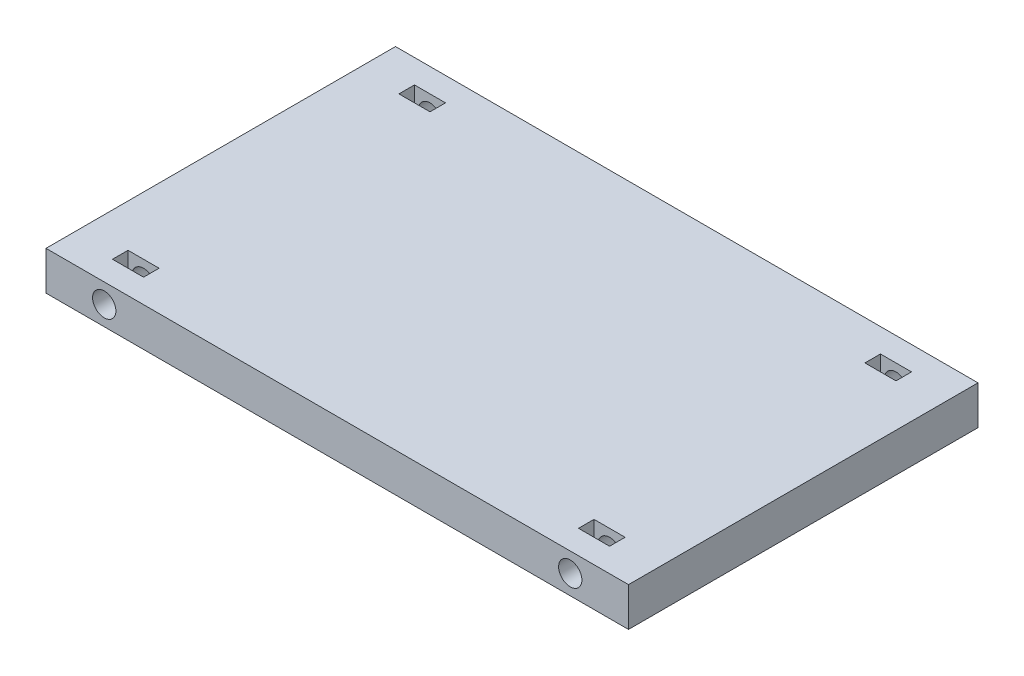
ISO-10303-21;
HEADER;
FILE_DESCRIPTION(('STEP AP214'),'2;1');
FILE_NAME('part.step','',(''),(''),'','','');
FILE_SCHEMA(('AUTOMOTIVE_DESIGN { 1 0 10303 214 1 1 1 1 }'));
ENDSEC;
DATA;
#1=APPLICATION_CONTEXT('core data for automotive mechanical design processes');
#2=APPLICATION_PROTOCOL_DEFINITION('international standard','automotive_design',2000,#1);
#3=PRODUCT_CONTEXT('',#1,'mechanical');
#4=PRODUCT('Part','Part','',(#3));
#5=PRODUCT_RELATED_PRODUCT_CATEGORY('part','',(#4));
#6=PRODUCT_DEFINITION_FORMATION('','',#4);
#7=PRODUCT_DEFINITION_CONTEXT('part definition',#1,'design');
#8=PRODUCT_DEFINITION('design','',#6,#7);
#9=PRODUCT_DEFINITION_SHAPE('','',#8);
#10=(LENGTH_UNIT() NAMED_UNIT(*) SI_UNIT(.MILLI.,.METRE.));
#11=(NAMED_UNIT(*) PLANE_ANGLE_UNIT() SI_UNIT($,.RADIAN.));
#12=(NAMED_UNIT(*) SI_UNIT($,.STERADIAN.) SOLID_ANGLE_UNIT());
#13=UNCERTAINTY_MEASURE_WITH_UNIT(LENGTH_MEASURE(1.E-05),#10,'distance_accuracy_value','');
#14=(GEOMETRIC_REPRESENTATION_CONTEXT(3) GLOBAL_UNCERTAINTY_ASSIGNED_CONTEXT((#13)) GLOBAL_UNIT_ASSIGNED_CONTEXT((#10,
#11,#12)) REPRESENTATION_CONTEXT('',''));
#15=CARTESIAN_POINT('',(0.,0.,0.));
#16=DIRECTION('',(0.,0.,1.));
#17=DIRECTION('',(1.,0.,0.));
#18=AXIS2_PLACEMENT_3D('',#15,#16,#17);
#19=CARTESIAN_POINT('',(0.,10.,0.));
#20=DIRECTION('',(0.,-1.,0.));
#21=DIRECTION('',(0.,0.,-1.));
#22=AXIS2_PLACEMENT_3D('',#19,#20,#21);
#23=PLANE('',#22);
#24=DIRECTION('',(-1.,0.,0.));
#25=VECTOR('',#24,1.);
#26=CARTESIAN_POINT('',(131.,10.,-10.1205593047083));
#27=LINE('',#26,#25);
#28=CARTESIAN_POINT('',(139.,10.,-10.1205593047083));
#29=VERTEX_POINT('',#28);
#30=CARTESIAN_POINT('',(131.,10.,-10.1205593047083));
#31=VERTEX_POINT('',#30);
#32=EDGE_CURVE('E210',#29,#31,#27,.T.);
#33=ORIENTED_EDGE('',*,*,#32,.F.);
#34=DIRECTION('',(0.,0.,-1.));
#35=VECTOR('',#34,1.);
#36=CARTESIAN_POINT('',(139.,10.,-10.1205593047083));
#37=LINE('',#36,#35);
#38=CARTESIAN_POINT('',(139.,10.,-6.12055930470834));
#39=VERTEX_POINT('',#38);
#40=EDGE_CURVE('E218',#39,#29,#37,.T.);
#41=ORIENTED_EDGE('',*,*,#40,.F.);
#42=DIRECTION('',(1.,0.,0.));
#43=VECTOR('',#42,1.);
#44=CARTESIAN_POINT('',(131.,10.,-6.12055930470834));
#45=LINE('',#44,#43);
#46=CARTESIAN_POINT('',(131.,10.,-6.12055930470834));
#47=VERTEX_POINT('',#46);
#48=EDGE_CURVE('E215',#47,#39,#45,.T.);
#49=ORIENTED_EDGE('',*,*,#48,.F.);
#50=DIRECTION('',(0.,0.,1.));
#51=VECTOR('',#50,1.);
#52=CARTESIAN_POINT('',(131.,10.,-10.1205593047083));
#53=LINE('',#52,#51);
#54=EDGE_CURVE('E212',#31,#47,#53,.T.);
#55=ORIENTED_EDGE('',*,*,#54,.F.);
#56=EDGE_LOOP('',(#33,#41,#49,#55));
#57=FACE_BOUND('',#56,.T.);
#58=DIRECTION('',(0.,0.,1.));
#59=VECTOR('',#58,1.);
#60=CARTESIAN_POINT('',(11.,10.,-83.8794406952916));
#61=LINE('',#60,#59);
#62=CARTESIAN_POINT('',(11.,10.,-83.8794406952916));
#63=VERTEX_POINT('',#62);
#64=CARTESIAN_POINT('',(11.,10.,-79.8794406952916));
#65=VERTEX_POINT('',#64);
#66=EDGE_CURVE('E272',#63,#65,#61,.T.);
#67=ORIENTED_EDGE('',*,*,#66,.F.);
#68=DIRECTION('',(-1.,0.,0.));
#69=VECTOR('',#68,1.);
#70=CARTESIAN_POINT('',(11.,10.,-83.8794406952916));
#71=LINE('',#70,#69);
#72=CARTESIAN_POINT('',(19.,10.,-83.8794406952916));
#73=VERTEX_POINT('',#72);
#74=EDGE_CURVE('E280',#73,#63,#71,.T.);
#75=ORIENTED_EDGE('',*,*,#74,.F.);
#76=DIRECTION('',(0.,0.,-1.));
#77=VECTOR('',#76,1.);
#78=CARTESIAN_POINT('',(19.,10.,-83.8794406952916));
#79=LINE('',#78,#77);
#80=CARTESIAN_POINT('',(19.,10.,-79.8794406952916));
#81=VERTEX_POINT('',#80);
#82=EDGE_CURVE('E277',#81,#73,#79,.T.);
#83=ORIENTED_EDGE('',*,*,#82,.F.);
#84=DIRECTION('',(1.,0.,0.));
#85=VECTOR('',#84,1.);
#86=CARTESIAN_POINT('',(11.,10.,-79.8794406952916));
#87=LINE('',#86,#85);
#88=EDGE_CURVE('E274',#65,#81,#87,.T.);
#89=ORIENTED_EDGE('',*,*,#88,.F.);
#90=EDGE_LOOP('',(#67,#75,#83,#89));
#91=FACE_BOUND('',#90,.T.);
#92=DIRECTION('',(0.,0.,1.));
#93=VECTOR('',#92,1.);
#94=CARTESIAN_POINT('',(0.,10.,0.));
#95=LINE('',#94,#93);
#96=CARTESIAN_POINT('',(0.,10.,-90.));
#97=VERTEX_POINT('',#96);
#98=CARTESIAN_POINT('',(0.,10.,0.));
#99=VERTEX_POINT('',#98);
#100=EDGE_CURVE('E303',#97,#99,#95,.T.);
#101=ORIENTED_EDGE('',*,*,#100,.T.);
#102=DIRECTION('',(1.,0.,0.));
#103=VECTOR('',#102,1.);
#104=CARTESIAN_POINT('',(0.,10.,0.));
#105=LINE('',#104,#103);
#106=CARTESIAN_POINT('',(150.,10.,0.));
#107=VERTEX_POINT('',#106);
#108=EDGE_CURVE('E306',#99,#107,#105,.T.);
#109=ORIENTED_EDGE('',*,*,#108,.T.);
#110=DIRECTION('',(0.,0.,-1.));
#111=VECTOR('',#110,1.);
#112=CARTESIAN_POINT('',(150.,10.,0.));
#113=LINE('',#112,#111);
#114=CARTESIAN_POINT('',(150.,10.,-90.));
#115=VERTEX_POINT('',#114);
#116=EDGE_CURVE('E309',#107,#115,#113,.T.);
#117=ORIENTED_EDGE('',*,*,#116,.T.);
#118=DIRECTION('',(-1.,0.,0.));
#119=VECTOR('',#118,1.);
#120=CARTESIAN_POINT('',(0.,10.,-90.));
#121=LINE('',#120,#119);
#122=EDGE_CURVE('E311',#115,#97,#121,.T.);
#123=ORIENTED_EDGE('',*,*,#122,.T.);
#124=EDGE_LOOP('',(#101,#109,#117,#123));
#125=FACE_BOUND('',#124,.T.);
#126=DIRECTION('',(0.,0.,1.));
#127=VECTOR('',#126,1.);
#128=CARTESIAN_POINT('',(131.,10.,-79.8794406952916));
#129=LINE('',#128,#127);
#130=CARTESIAN_POINT('',(131.,10.,-83.8794406952916));
#131=VERTEX_POINT('',#130);
#132=CARTESIAN_POINT('',(131.,10.,-79.8794406952916));
#133=VERTEX_POINT('',#132);
#134=EDGE_CURVE('E241',#131,#133,#129,.T.);
#135=ORIENTED_EDGE('',*,*,#134,.F.);
#136=DIRECTION('',(-1.,0.,0.));
#137=VECTOR('',#136,1.);
#138=CARTESIAN_POINT('',(131.,10.,-83.8794406952916));
#139=LINE('',#138,#137);
#140=CARTESIAN_POINT('',(139.,10.,-83.8794406952916));
#141=VERTEX_POINT('',#140);
#142=EDGE_CURVE('E249',#141,#131,#139,.T.);
#143=ORIENTED_EDGE('',*,*,#142,.F.);
#144=DIRECTION('',(0.,0.,-1.));
#145=VECTOR('',#144,1.);
#146=CARTESIAN_POINT('',(139.,10.,-79.8794406952916));
#147=LINE('',#146,#145);
#148=CARTESIAN_POINT('',(139.,10.,-79.8794406952916));
#149=VERTEX_POINT('',#148);
#150=EDGE_CURVE('E246',#149,#141,#147,.T.);
#151=ORIENTED_EDGE('',*,*,#150,.F.);
#152=DIRECTION('',(1.,0.,0.));
#153=VECTOR('',#152,1.);
#154=CARTESIAN_POINT('',(131.,10.,-79.8794406952916));
#155=LINE('',#154,#153);
#156=EDGE_CURVE('E243',#133,#149,#155,.T.);
#157=ORIENTED_EDGE('',*,*,#156,.F.);
#158=EDGE_LOOP('',(#135,#143,#151,#157));
#159=FACE_BOUND('',#158,.T.);
#160=DIRECTION('',(1.,0.,0.));
#161=VECTOR('',#160,1.);
#162=CARTESIAN_POINT('',(11.,10.,-6.12055930470834));
#163=LINE('',#162,#161);
#164=CARTESIAN_POINT('',(11.,10.,-6.12055930470834));
#165=VERTEX_POINT('',#164);
#166=CARTESIAN_POINT('',(19.,10.,-6.12055930470834));
#167=VERTEX_POINT('',#166);
#168=EDGE_CURVE('E172',#165,#167,#163,.T.);
#169=ORIENTED_EDGE('',*,*,#168,.F.);
#170=DIRECTION('',(0.,0.,1.));
#171=VECTOR('',#170,1.);
#172=CARTESIAN_POINT('',(11.,10.,-6.12055930470834));
#173=LINE('',#172,#171);
#174=CARTESIAN_POINT('',(11.,10.,-10.1205593047083));
#175=VERTEX_POINT('',#174);
#176=EDGE_CURVE('E194',#175,#165,#173,.T.);
#177=ORIENTED_EDGE('',*,*,#176,.F.);
#178=DIRECTION('',(-1.,0.,0.));
#179=VECTOR('',#178,1.);
#180=CARTESIAN_POINT('',(11.,10.,-10.1205593047083));
#181=LINE('',#180,#179);
#182=CARTESIAN_POINT('',(19.,10.,-10.1205593047083));
#183=VERTEX_POINT('',#182);
#184=EDGE_CURVE('E192',#183,#175,#181,.T.);
#185=ORIENTED_EDGE('',*,*,#184,.F.);
#186=DIRECTION('',(0.,0.,-1.));
#187=VECTOR('',#186,1.);
#188=CARTESIAN_POINT('',(19.,10.,-6.12055930470834));
#189=LINE('',#188,#187);
#190=EDGE_CURVE('E180',#167,#183,#189,.T.);
#191=ORIENTED_EDGE('',*,*,#190,.F.);
#192=EDGE_LOOP('',(#169,#177,#185,#191));
#193=FACE_BOUND('',#192,.T.);
#194=ADVANCED_FACE('F33',(#57,#91,#125,#159,#193),#23,.F.);
#195=CARTESIAN_POINT('',(0.,0.,0.));
#196=DIRECTION('',(0.,-1.,0.));
#197=DIRECTION('',(0.,0.,-1.));
#198=AXIS2_PLACEMENT_3D('',#195,#196,#197);
#199=PLANE('',#198);
#200=DIRECTION('',(0.,0.,1.));
#201=VECTOR('',#200,1.);
#202=CARTESIAN_POINT('',(0.,0.,0.));
#203=LINE('',#202,#201);
#204=CARTESIAN_POINT('',(0.,0.,-90.));
#205=VERTEX_POINT('',#204);
#206=CARTESIAN_POINT('',(0.,0.,0.));
#207=VERTEX_POINT('',#206);
#208=EDGE_CURVE('E302',#205,#207,#203,.T.);
#209=ORIENTED_EDGE('',*,*,#208,.F.);
#210=DIRECTION('',(-1.,0.,0.));
#211=VECTOR('',#210,1.);
#212=CARTESIAN_POINT('',(0.,0.,-90.));
#213=LINE('',#212,#211);
#214=CARTESIAN_POINT('',(150.,0.,-90.));
#215=VERTEX_POINT('',#214);
#216=EDGE_CURVE('E307',#215,#205,#213,.T.);
#217=ORIENTED_EDGE('',*,*,#216,.F.);
#218=DIRECTION('',(0.,0.,-1.));
#219=VECTOR('',#218,1.);
#220=CARTESIAN_POINT('',(150.,0.,0.));
#221=LINE('',#220,#219);
#222=CARTESIAN_POINT('',(150.,0.,0.));
#223=VERTEX_POINT('',#222);
#224=EDGE_CURVE('E318',#223,#215,#221,.T.);
#225=ORIENTED_EDGE('',*,*,#224,.F.);
#226=DIRECTION('',(1.,0.,0.));
#227=VECTOR('',#226,1.);
#228=CARTESIAN_POINT('',(0.,0.,0.));
#229=LINE('',#228,#227);
#230=EDGE_CURVE('E316',#207,#223,#229,.T.);
#231=ORIENTED_EDGE('',*,*,#230,.F.);
#232=EDGE_LOOP('',(#209,#217,#225,#231));
#233=FACE_BOUND('',#232,.T.);
#234=DIRECTION('',(-1.,0.,0.));
#235=VECTOR('',#234,1.);
#236=CARTESIAN_POINT('',(11.,0.,-83.8794406952916));
#237=LINE('',#236,#235);
#238=CARTESIAN_POINT('',(19.,0.,-83.8794406952916));
#239=VERTEX_POINT('',#238);
#240=CARTESIAN_POINT('',(11.,0.,-83.8794406952916));
#241=VERTEX_POINT('',#240);
#242=EDGE_CURVE('E275',#239,#241,#237,.T.);
#243=ORIENTED_EDGE('',*,*,#242,.T.);
#244=DIRECTION('',(0.,0.,1.));
#245=VECTOR('',#244,1.);
#246=CARTESIAN_POINT('',(11.,0.,-83.8794406952916));
#247=LINE('',#246,#245);
#248=CARTESIAN_POINT('',(11.,0.,-79.8794406952916));
#249=VERTEX_POINT('',#248);
#250=EDGE_CURVE('E271',#241,#249,#247,.T.);
#251=ORIENTED_EDGE('',*,*,#250,.T.);
#252=DIRECTION('',(1.,0.,0.));
#253=VECTOR('',#252,1.);
#254=CARTESIAN_POINT('',(11.,0.,-79.8794406952916));
#255=LINE('',#254,#253);
#256=CARTESIAN_POINT('',(19.,0.,-79.8794406952916));
#257=VERTEX_POINT('',#256);
#258=EDGE_CURVE('E285',#249,#257,#255,.T.);
#259=ORIENTED_EDGE('',*,*,#258,.T.);
#260=DIRECTION('',(0.,0.,-1.));
#261=VECTOR('',#260,1.);
#262=CARTESIAN_POINT('',(19.,0.,-83.8794406952916));
#263=LINE('',#262,#261);
#264=EDGE_CURVE('E288',#257,#239,#263,.T.);
#265=ORIENTED_EDGE('',*,*,#264,.T.);
#266=EDGE_LOOP('',(#243,#251,#259,#265));
#267=FACE_BOUND('',#266,.T.);
#268=DIRECTION('',(-1.,0.,0.));
#269=VECTOR('',#268,1.);
#270=CARTESIAN_POINT('',(131.,0.,-83.8794406952916));
#271=LINE('',#270,#269);
#272=CARTESIAN_POINT('',(139.,0.,-83.8794406952916));
#273=VERTEX_POINT('',#272);
#274=CARTESIAN_POINT('',(131.,0.,-83.8794406952916));
#275=VERTEX_POINT('',#274);
#276=EDGE_CURVE('E244',#273,#275,#271,.T.);
#277=ORIENTED_EDGE('',*,*,#276,.T.);
#278=DIRECTION('',(0.,0.,1.));
#279=VECTOR('',#278,1.);
#280=CARTESIAN_POINT('',(131.,0.,-79.8794406952916));
#281=LINE('',#280,#279);
#282=CARTESIAN_POINT('',(131.,0.,-79.8794406952916));
#283=VERTEX_POINT('',#282);
#284=EDGE_CURVE('E240',#275,#283,#281,.T.);
#285=ORIENTED_EDGE('',*,*,#284,.T.);
#286=DIRECTION('',(1.,0.,0.));
#287=VECTOR('',#286,1.);
#288=CARTESIAN_POINT('',(131.,0.,-79.8794406952916));
#289=LINE('',#288,#287);
#290=CARTESIAN_POINT('',(139.,0.,-79.8794406952916));
#291=VERTEX_POINT('',#290);
#292=EDGE_CURVE('E254',#283,#291,#289,.T.);
#293=ORIENTED_EDGE('',*,*,#292,.T.);
#294=DIRECTION('',(0.,0.,-1.));
#295=VECTOR('',#294,1.);
#296=CARTESIAN_POINT('',(139.,0.,-79.8794406952916));
#297=LINE('',#296,#295);
#298=EDGE_CURVE('E257',#291,#273,#297,.T.);
#299=ORIENTED_EDGE('',*,*,#298,.T.);
#300=EDGE_LOOP('',(#277,#285,#293,#299));
#301=FACE_BOUND('',#300,.T.);
#302=DIRECTION('',(0.,0.,-1.));
#303=VECTOR('',#302,1.);
#304=CARTESIAN_POINT('',(139.,0.,-10.1205593047083));
#305=LINE('',#304,#303);
#306=CARTESIAN_POINT('',(139.,0.,-6.12055930470834));
#307=VERTEX_POINT('',#306);
#308=CARTESIAN_POINT('',(139.,0.,-10.1205593047083));
#309=VERTEX_POINT('',#308);
#310=EDGE_CURVE('E213',#307,#309,#305,.T.);
#311=ORIENTED_EDGE('',*,*,#310,.T.);
#312=DIRECTION('',(-1.,0.,0.));
#313=VECTOR('',#312,1.);
#314=CARTESIAN_POINT('',(131.,0.,-10.1205593047083));
#315=LINE('',#314,#313);
#316=CARTESIAN_POINT('',(131.,0.,-10.1205593047083));
#317=VERTEX_POINT('',#316);
#318=EDGE_CURVE('E188',#309,#317,#315,.T.);
#319=ORIENTED_EDGE('',*,*,#318,.T.);
#320=DIRECTION('',(0.,0.,1.));
#321=VECTOR('',#320,1.);
#322=CARTESIAN_POINT('',(131.,0.,-10.1205593047083));
#323=LINE('',#322,#321);
#324=CARTESIAN_POINT('',(131.,0.,-6.12055930470834));
#325=VERTEX_POINT('',#324);
#326=EDGE_CURVE('E223',#317,#325,#323,.T.);
#327=ORIENTED_EDGE('',*,*,#326,.T.);
#328=DIRECTION('',(1.,0.,0.));
#329=VECTOR('',#328,1.);
#330=CARTESIAN_POINT('',(131.,0.,-6.12055930470834));
#331=LINE('',#330,#329);
#332=EDGE_CURVE('E226',#325,#307,#331,.T.);
#333=ORIENTED_EDGE('',*,*,#332,.T.);
#334=EDGE_LOOP('',(#311,#319,#327,#333));
#335=FACE_BOUND('',#334,.T.);
#336=DIRECTION('',(0.,0.,1.));
#337=VECTOR('',#336,1.);
#338=CARTESIAN_POINT('',(11.,0.,-6.12055930470834));
#339=LINE('',#338,#337);
#340=CARTESIAN_POINT('',(11.,0.,-10.1205593047083));
#341=VERTEX_POINT('',#340);
#342=CARTESIAN_POINT('',(11.,0.,-6.12055930470834));
#343=VERTEX_POINT('',#342);
#344=EDGE_CURVE('E181',#341,#343,#339,.T.);
#345=ORIENTED_EDGE('',*,*,#344,.T.);
#346=DIRECTION('',(1.,0.,0.));
#347=VECTOR('',#346,1.);
#348=CARTESIAN_POINT('',(11.,0.,-6.12055930470834));
#349=LINE('',#348,#347);
#350=CARTESIAN_POINT('',(19.,0.,-6.12055930470834));
#351=VERTEX_POINT('',#350);
#352=EDGE_CURVE('E58',#343,#351,#349,.T.);
#353=ORIENTED_EDGE('',*,*,#352,.T.);
#354=DIRECTION('',(0.,0.,-1.));
#355=VECTOR('',#354,1.);
#356=CARTESIAN_POINT('',(19.,0.,-6.12055930470834));
#357=LINE('',#356,#355);
#358=CARTESIAN_POINT('',(19.,0.,-10.1205593047083));
#359=VERTEX_POINT('',#358);
#360=EDGE_CURVE('E187',#351,#359,#357,.T.);
#361=ORIENTED_EDGE('',*,*,#360,.T.);
#362=DIRECTION('',(-1.,0.,0.));
#363=VECTOR('',#362,1.);
#364=CARTESIAN_POINT('',(11.,0.,-10.1205593047083));
#365=LINE('',#364,#363);
#366=EDGE_CURVE('E202',#359,#341,#365,.T.);
#367=ORIENTED_EDGE('',*,*,#366,.T.);
#368=EDGE_LOOP('',(#345,#353,#361,#367));
#369=FACE_BOUND('',#368,.T.);
#370=ADVANCED_FACE('F385',(#233,#267,#301,#335,#369),#199,.T.);
#371=CARTESIAN_POINT('',(0.,10.,0.));
#372=DIRECTION('',(1.,0.,0.));
#373=DIRECTION('',(0.,0.,-1.));
#374=AXIS2_PLACEMENT_3D('',#371,#372,#373);
#375=PLANE('',#374);
#376=ORIENTED_EDGE('',*,*,#208,.T.);
#377=DIRECTION('',(0.,-1.,0.));
#378=VECTOR('',#377,1.);
#379=CARTESIAN_POINT('',(0.,10.,0.));
#380=LINE('',#379,#378);
#381=EDGE_CURVE('E11',#99,#207,#380,.T.);
#382=ORIENTED_EDGE('',*,*,#381,.F.);
#383=ORIENTED_EDGE('',*,*,#100,.F.);
#384=DIRECTION('',(0.,-1.,0.));
#385=VECTOR('',#384,1.);
#386=CARTESIAN_POINT('',(0.,10.,-90.));
#387=LINE('',#386,#385);
#388=EDGE_CURVE('E313',#97,#205,#387,.T.);
#389=ORIENTED_EDGE('',*,*,#388,.T.);
#390=EDGE_LOOP('',(#376,#382,#383,#389));
#391=FACE_BOUND('',#390,.T.);
#392=ADVANCED_FACE('F35',(#391),#375,.F.);
#393=CARTESIAN_POINT('',(0.,10.,0.));
#394=DIRECTION('',(0.,0.,-1.));
#395=DIRECTION('',(-1.,0.,0.));
#396=AXIS2_PLACEMENT_3D('',#393,#394,#395);
#397=PLANE('',#396);
#398=CARTESIAN_POINT('',(135.,5.,0.));
#399=DIRECTION('',(0.,0.,1.));
#400=DIRECTION('',(1.,0.,0.));
#401=AXIS2_PLACEMENT_3D('',#398,#399,#400);
#402=CIRCLE('',#401,2.99999999999999);
#403=CARTESIAN_POINT('',(138.,5.,0.));
#404=VERTEX_POINT('',#403);
#405=EDGE_CURVE('E343',#404,#404,#402,.T.);
#406=ORIENTED_EDGE('',*,*,#405,.F.);
#407=EDGE_LOOP('',(#406));
#408=FACE_BOUND('',#407,.T.);
#409=CARTESIAN_POINT('',(15.,5.,0.));
#410=DIRECTION('',(0.,0.,1.));
#411=DIRECTION('',(1.,0.,0.));
#412=AXIS2_PLACEMENT_3D('',#409,#410,#411);
#413=CIRCLE('',#412,3.);
#414=CARTESIAN_POINT('',(18.,5.,0.));
#415=VERTEX_POINT('',#414);
#416=EDGE_CURVE('E362',#415,#415,#413,.T.);
#417=ORIENTED_EDGE('',*,*,#416,.F.);
#418=EDGE_LOOP('',(#417));
#419=FACE_BOUND('',#418,.T.);
#420=ORIENTED_EDGE('',*,*,#230,.T.);
#421=DIRECTION('',(0.,-1.,0.));
#422=VECTOR('',#421,1.);
#423=CARTESIAN_POINT('',(150.,10.,0.));
#424=LINE('',#423,#422);
#425=EDGE_CURVE('E42',#107,#223,#424,.T.);
#426=ORIENTED_EDGE('',*,*,#425,.F.);
#427=ORIENTED_EDGE('',*,*,#108,.F.);
#428=ORIENTED_EDGE('',*,*,#381,.T.);
#429=EDGE_LOOP('',(#420,#426,#427,#428));
#430=FACE_BOUND('',#429,.T.);
#431=ADVANCED_FACE('F405',(#408,#419,#430),#397,.F.);
#432=CARTESIAN_POINT('',(150.,10.,0.));
#433=DIRECTION('',(-1.,0.,0.));
#434=DIRECTION('',(0.,0.,1.));
#435=AXIS2_PLACEMENT_3D('',#432,#433,#434);
#436=PLANE('',#435);
#437=ORIENTED_EDGE('',*,*,#224,.T.);
#438=DIRECTION('',(0.,-1.,0.));
#439=VECTOR('',#438,1.);
#440=CARTESIAN_POINT('',(150.,10.,-90.));
#441=LINE('',#440,#439);
#442=EDGE_CURVE('E323',#115,#215,#441,.T.);
#443=ORIENTED_EDGE('',*,*,#442,.F.);
#444=ORIENTED_EDGE('',*,*,#116,.F.);
#445=ORIENTED_EDGE('',*,*,#425,.T.);
#446=EDGE_LOOP('',(#437,#443,#444,#445));
#447=FACE_BOUND('',#446,.T.);
#448=ADVANCED_FACE('F402',(#447),#436,.F.);
#449=CARTESIAN_POINT('',(0.,10.,-90.));
#450=DIRECTION('',(0.,0.,1.));
#451=DIRECTION('',(1.,0.,0.));
#452=AXIS2_PLACEMENT_3D('',#449,#450,#451);
#453=PLANE('',#452);
#454=CARTESIAN_POINT('',(135.,4.99999999999998,-90.));
#455=DIRECTION('',(0.,0.,-1.));
#456=DIRECTION('',(-1.,0.,0.));
#457=AXIS2_PLACEMENT_3D('',#454,#455,#456);
#458=CIRCLE('',#457,2.99999999999999);
#459=CARTESIAN_POINT('',(132.,4.99999999999998,-90.));
#460=VERTEX_POINT('',#459);
#461=EDGE_CURVE('E623',#460,#460,#458,.T.);
#462=ORIENTED_EDGE('',*,*,#461,.F.);
#463=EDGE_LOOP('',(#462));
#464=FACE_BOUND('',#463,.T.);
#465=CARTESIAN_POINT('',(15.,5.,-90.));
#466=DIRECTION('',(0.,0.,-1.));
#467=DIRECTION('',(-1.,0.,0.));
#468=AXIS2_PLACEMENT_3D('',#465,#466,#467);
#469=CIRCLE('',#468,3.);
#470=CARTESIAN_POINT('',(12.,5.,-90.));
#471=VERTEX_POINT('',#470);
#472=EDGE_CURVE('E346',#471,#471,#469,.T.);
#473=ORIENTED_EDGE('',*,*,#472,.F.);
#474=EDGE_LOOP('',(#473));
#475=FACE_BOUND('',#474,.T.);
#476=ORIENTED_EDGE('',*,*,#216,.T.);
#477=ORIENTED_EDGE('',*,*,#388,.F.);
#478=ORIENTED_EDGE('',*,*,#122,.F.);
#479=ORIENTED_EDGE('',*,*,#442,.T.);
#480=EDGE_LOOP('',(#476,#477,#478,#479));
#481=FACE_BOUND('',#480,.T.);
#482=ADVANCED_FACE('F399',(#464,#475,#481),#453,.F.);
#483=CARTESIAN_POINT('',(11.,10.,-83.8794406952916));
#484=DIRECTION('',(1.,0.,0.));
#485=DIRECTION('',(0.,0.,-1.));
#486=AXIS2_PLACEMENT_3D('',#483,#484,#485);
#487=PLANE('',#486);
#488=ORIENTED_EDGE('',*,*,#250,.F.);
#489=DIRECTION('',(0.,-1.,0.));
#490=VECTOR('',#489,1.);
#491=CARTESIAN_POINT('',(11.,10.,-83.8794406952916));
#492=LINE('',#491,#490);
#493=EDGE_CURVE('E282',#63,#241,#492,.T.);
#494=ORIENTED_EDGE('',*,*,#493,.F.);
#495=ORIENTED_EDGE('',*,*,#66,.T.);
#496=DIRECTION('',(0.,-1.,0.));
#497=VECTOR('',#496,1.);
#498=CARTESIAN_POINT('',(11.,10.,-79.8794406952916));
#499=LINE('',#498,#497);
#500=EDGE_CURVE('E299',#65,#249,#499,.T.);
#501=ORIENTED_EDGE('',*,*,#500,.T.);
#502=EDGE_LOOP('',(#488,#494,#495,#501));
#503=FACE_BOUND('',#502,.T.);
#504=ADVANCED_FACE('F396',(#503),#487,.T.);
#505=CARTESIAN_POINT('',(11.,10.,-79.8794406952916));
#506=DIRECTION('',(0.,0.,-1.));
#507=DIRECTION('',(-1.,0.,0.));
#508=AXIS2_PLACEMENT_3D('',#505,#506,#507);
#509=PLANE('',#508);
#510=CARTESIAN_POINT('',(15.,5.,-79.8794406952916));
#511=DIRECTION('',(0.,0.,-1.));
#512=DIRECTION('',(-1.,0.,0.));
#513=AXIS2_PLACEMENT_3D('',#510,#511,#512);
#514=CIRCLE('',#513,3.);
#515=CARTESIAN_POINT('',(12.,5.,-79.8794406952916));
#516=VERTEX_POINT('',#515);
#517=EDGE_CURVE('E338',#516,#516,#514,.T.);
#518=ORIENTED_EDGE('',*,*,#517,.F.);
#519=EDGE_LOOP('',(#518));
#520=FACE_BOUND('',#519,.T.);
#521=ORIENTED_EDGE('',*,*,#258,.F.);
#522=ORIENTED_EDGE('',*,*,#500,.F.);
#523=ORIENTED_EDGE('',*,*,#88,.T.);
#524=DIRECTION('',(0.,-1.,0.));
#525=VECTOR('',#524,1.);
#526=CARTESIAN_POINT('',(19.,10.,-79.8794406952916));
#527=LINE('',#526,#525);
#528=EDGE_CURVE('E297',#81,#257,#527,.T.);
#529=ORIENTED_EDGE('',*,*,#528,.T.);
#530=EDGE_LOOP('',(#521,#522,#523,#529));
#531=FACE_BOUND('',#530,.T.);
#532=ADVANCED_FACE('F471',(#520,#531),#509,.T.);
#533=CARTESIAN_POINT('',(19.,10.,-83.8794406952916));
#534=DIRECTION('',(-1.,0.,0.));
#535=DIRECTION('',(0.,0.,1.));
#536=AXIS2_PLACEMENT_3D('',#533,#534,#535);
#537=PLANE('',#536);
#538=ORIENTED_EDGE('',*,*,#264,.F.);
#539=ORIENTED_EDGE('',*,*,#528,.F.);
#540=ORIENTED_EDGE('',*,*,#82,.T.);
#541=DIRECTION('',(0.,-1.,0.));
#542=VECTOR('',#541,1.);
#543=CARTESIAN_POINT('',(19.,10.,-83.8794406952916));
#544=LINE('',#543,#542);
#545=EDGE_CURVE('E295',#73,#239,#544,.T.);
#546=ORIENTED_EDGE('',*,*,#545,.T.);
#547=EDGE_LOOP('',(#538,#539,#540,#546));
#548=FACE_BOUND('',#547,.T.);
#549=ADVANCED_FACE('F468',(#548),#537,.T.);
#550=CARTESIAN_POINT('',(11.,10.,-83.8794406952916));
#551=DIRECTION('',(0.,0.,1.));
#552=DIRECTION('',(1.,0.,0.));
#553=AXIS2_PLACEMENT_3D('',#550,#551,#552);
#554=PLANE('',#553);
#555=CARTESIAN_POINT('',(15.,5.,-83.8794406952916));
#556=DIRECTION('',(0.,0.,1.));
#557=DIRECTION('',(1.,0.,0.));
#558=AXIS2_PLACEMENT_3D('',#555,#556,#557);
#559=CIRCLE('',#558,3.);
#560=CARTESIAN_POINT('',(18.,5.,-83.8794406952916));
#561=VERTEX_POINT('',#560);
#562=EDGE_CURVE('E336',#561,#561,#559,.T.);
#563=ORIENTED_EDGE('',*,*,#562,.F.);
#564=EDGE_LOOP('',(#563));
#565=FACE_BOUND('',#564,.T.);
#566=ORIENTED_EDGE('',*,*,#242,.F.);
#567=ORIENTED_EDGE('',*,*,#545,.F.);
#568=ORIENTED_EDGE('',*,*,#74,.T.);
#569=ORIENTED_EDGE('',*,*,#493,.T.);
#570=EDGE_LOOP('',(#566,#567,#568,#569));
#571=FACE_BOUND('',#570,.T.);
#572=ADVANCED_FACE('F465',(#565,#571),#554,.T.);
#573=CARTESIAN_POINT('',(131.,10.,-79.8794406952916));
#574=DIRECTION('',(1.,0.,0.));
#575=DIRECTION('',(0.,0.,-1.));
#576=AXIS2_PLACEMENT_3D('',#573,#574,#575);
#577=PLANE('',#576);
#578=ORIENTED_EDGE('',*,*,#284,.F.);
#579=DIRECTION('',(0.,-1.,0.));
#580=VECTOR('',#579,1.);
#581=CARTESIAN_POINT('',(131.,10.,-83.8794406952916));
#582=LINE('',#581,#580);
#583=EDGE_CURVE('E251',#131,#275,#582,.T.);
#584=ORIENTED_EDGE('',*,*,#583,.F.);
#585=ORIENTED_EDGE('',*,*,#134,.T.);
#586=DIRECTION('',(0.,-1.,0.));
#587=VECTOR('',#586,1.);
#588=CARTESIAN_POINT('',(131.,10.,-79.8794406952916));
#589=LINE('',#588,#587);
#590=EDGE_CURVE('E268',#133,#283,#589,.T.);
#591=ORIENTED_EDGE('',*,*,#590,.T.);
#592=EDGE_LOOP('',(#578,#584,#585,#591));
#593=FACE_BOUND('',#592,.T.);
#594=ADVANCED_FACE('F438',(#593),#577,.T.);
#595=CARTESIAN_POINT('',(131.,10.,-79.8794406952916));
#596=DIRECTION('',(0.,0.,-1.));
#597=DIRECTION('',(-1.,0.,0.));
#598=AXIS2_PLACEMENT_3D('',#595,#596,#597);
#599=PLANE('',#598);
#600=CARTESIAN_POINT('',(135.,4.99999999999998,-79.8794406952916));
#601=DIRECTION('',(0.,0.,-1.));
#602=DIRECTION('',(-1.,0.,0.));
#603=AXIS2_PLACEMENT_3D('',#600,#601,#602);
#604=CIRCLE('',#603,2.99999999999999);
#605=CARTESIAN_POINT('',(132.,4.99999999999998,-79.8794406952916));
#606=VERTEX_POINT('',#605);
#607=EDGE_CURVE('E351',#606,#606,#604,.T.);
#608=ORIENTED_EDGE('',*,*,#607,.F.);
#609=EDGE_LOOP('',(#608));
#610=FACE_BOUND('',#609,.T.);
#611=ORIENTED_EDGE('',*,*,#292,.F.);
#612=ORIENTED_EDGE('',*,*,#590,.F.);
#613=ORIENTED_EDGE('',*,*,#156,.T.);
#614=DIRECTION('',(0.,-1.,0.));
#615=VECTOR('',#614,1.);
#616=CARTESIAN_POINT('',(139.,10.,-79.8794406952916));
#617=LINE('',#616,#615);
#618=EDGE_CURVE('E266',#149,#291,#617,.T.);
#619=ORIENTED_EDGE('',*,*,#618,.T.);
#620=EDGE_LOOP('',(#611,#612,#613,#619));
#621=FACE_BOUND('',#620,.T.);
#622=ADVANCED_FACE('F440',(#610,#621),#599,.T.);
#623=CARTESIAN_POINT('',(139.,10.,-79.8794406952916));
#624=DIRECTION('',(-1.,0.,0.));
#625=DIRECTION('',(0.,0.,1.));
#626=AXIS2_PLACEMENT_3D('',#623,#624,#625);
#627=PLANE('',#626);
#628=ORIENTED_EDGE('',*,*,#298,.F.);
#629=ORIENTED_EDGE('',*,*,#618,.F.);
#630=ORIENTED_EDGE('',*,*,#150,.T.);
#631=DIRECTION('',(0.,-1.,0.));
#632=VECTOR('',#631,1.);
#633=CARTESIAN_POINT('',(139.,10.,-83.8794406952916));
#634=LINE('',#633,#632);
#635=EDGE_CURVE('E264',#141,#273,#634,.T.);
#636=ORIENTED_EDGE('',*,*,#635,.T.);
#637=EDGE_LOOP('',(#628,#629,#630,#636));
#638=FACE_BOUND('',#637,.T.);
#639=ADVANCED_FACE('F449',(#638),#627,.T.);
#640=CARTESIAN_POINT('',(131.,10.,-83.8794406952916));
#641=DIRECTION('',(0.,0.,1.));
#642=DIRECTION('',(1.,0.,0.));
#643=AXIS2_PLACEMENT_3D('',#640,#641,#642);
#644=PLANE('',#643);
#645=CARTESIAN_POINT('',(135.,4.99999999999998,-83.8794406952916));
#646=DIRECTION('',(0.,0.,1.));
#647=DIRECTION('',(1.,0.,0.));
#648=AXIS2_PLACEMENT_3D('',#645,#646,#647);
#649=CIRCLE('',#648,2.99999999999999);
#650=CARTESIAN_POINT('',(138.,4.99999999999998,-83.8794406952916));
#651=VERTEX_POINT('',#650);
#652=EDGE_CURVE('E37',#651,#651,#649,.T.);
#653=ORIENTED_EDGE('',*,*,#652,.F.);
#654=EDGE_LOOP('',(#653));
#655=FACE_BOUND('',#654,.T.);
#656=ORIENTED_EDGE('',*,*,#276,.F.);
#657=ORIENTED_EDGE('',*,*,#635,.F.);
#658=ORIENTED_EDGE('',*,*,#142,.T.);
#659=ORIENTED_EDGE('',*,*,#583,.T.);
#660=EDGE_LOOP('',(#656,#657,#658,#659));
#661=FACE_BOUND('',#660,.T.);
#662=ADVANCED_FACE('F447',(#655,#661),#644,.T.);
#663=CARTESIAN_POINT('',(131.,10.,-10.1205593047083));
#664=DIRECTION('',(0.,0.,1.));
#665=DIRECTION('',(1.,0.,0.));
#666=AXIS2_PLACEMENT_3D('',#663,#664,#665);
#667=PLANE('',#666);
#668=CARTESIAN_POINT('',(135.,5.,-10.1205593047083));
#669=DIRECTION('',(0.,0.,1.));
#670=DIRECTION('',(1.,0.,0.));
#671=AXIS2_PLACEMENT_3D('',#668,#669,#670);
#672=CIRCLE('',#671,2.99999999999999);
#673=CARTESIAN_POINT('',(138.,5.,-10.1205593047083));
#674=VERTEX_POINT('',#673);
#675=EDGE_CURVE('E334',#674,#674,#672,.T.);
#676=ORIENTED_EDGE('',*,*,#675,.F.);
#677=EDGE_LOOP('',(#676));
#678=FACE_BOUND('',#677,.T.);
#679=ORIENTED_EDGE('',*,*,#318,.F.);
#680=DIRECTION('',(0.,-1.,0.));
#681=VECTOR('',#680,1.);
#682=CARTESIAN_POINT('',(139.,10.,-10.1205593047083));
#683=LINE('',#682,#681);
#684=EDGE_CURVE('E220',#29,#309,#683,.T.);
#685=ORIENTED_EDGE('',*,*,#684,.F.);
#686=ORIENTED_EDGE('',*,*,#32,.T.);
#687=DIRECTION('',(0.,-1.,0.));
#688=VECTOR('',#687,1.);
#689=CARTESIAN_POINT('',(131.,10.,-10.1205593047083));
#690=LINE('',#689,#688);
#691=EDGE_CURVE('E237',#31,#317,#690,.T.);
#692=ORIENTED_EDGE('',*,*,#691,.T.);
#693=EDGE_LOOP('',(#679,#685,#686,#692));
#694=FACE_BOUND('',#693,.T.);
#695=ADVANCED_FACE('F456',(#678,#694),#667,.T.);
#696=CARTESIAN_POINT('',(131.,10.,-10.1205593047083));
#697=DIRECTION('',(1.,0.,0.));
#698=DIRECTION('',(0.,0.,-1.));
#699=AXIS2_PLACEMENT_3D('',#696,#697,#698);
#700=PLANE('',#699);
#701=ORIENTED_EDGE('',*,*,#326,.F.);
#702=ORIENTED_EDGE('',*,*,#691,.F.);
#703=ORIENTED_EDGE('',*,*,#54,.T.);
#704=DIRECTION('',(0.,-1.,0.));
#705=VECTOR('',#704,1.);
#706=CARTESIAN_POINT('',(131.,10.,-6.12055930470834));
#707=LINE('',#706,#705);
#708=EDGE_CURVE('E235',#47,#325,#707,.T.);
#709=ORIENTED_EDGE('',*,*,#708,.T.);
#710=EDGE_LOOP('',(#701,#702,#703,#709));
#711=FACE_BOUND('',#710,.T.);
#712=ADVANCED_FACE('F688',(#711),#700,.T.);
#713=CARTESIAN_POINT('',(131.,10.,-6.12055930470834));
#714=DIRECTION('',(0.,0.,-1.));
#715=DIRECTION('',(-1.,0.,0.));
#716=AXIS2_PLACEMENT_3D('',#713,#714,#715);
#717=PLANE('',#716);
#718=CARTESIAN_POINT('',(135.,5.,-6.12055930470834));
#719=DIRECTION('',(0.,0.,-1.));
#720=DIRECTION('',(-1.,0.,0.));
#721=AXIS2_PLACEMENT_3D('',#718,#719,#720);
#722=CIRCLE('',#721,2.99999999999999);
#723=CARTESIAN_POINT('',(132.,5.,-6.12055930470834));
#724=VERTEX_POINT('',#723);
#725=EDGE_CURVE('E332',#724,#724,#722,.T.);
#726=ORIENTED_EDGE('',*,*,#725,.F.);
#727=EDGE_LOOP('',(#726));
#728=FACE_BOUND('',#727,.T.);
#729=ORIENTED_EDGE('',*,*,#332,.F.);
#730=ORIENTED_EDGE('',*,*,#708,.F.);
#731=ORIENTED_EDGE('',*,*,#48,.T.);
#732=DIRECTION('',(0.,-1.,0.));
#733=VECTOR('',#732,1.);
#734=CARTESIAN_POINT('',(139.,10.,-6.12055930470834));
#735=LINE('',#734,#733);
#736=EDGE_CURVE('E233',#39,#307,#735,.T.);
#737=ORIENTED_EDGE('',*,*,#736,.T.);
#738=EDGE_LOOP('',(#729,#730,#731,#737));
#739=FACE_BOUND('',#738,.T.);
#740=ADVANCED_FACE('F381',(#728,#739),#717,.T.);
#741=CARTESIAN_POINT('',(139.,10.,-10.1205593047083));
#742=DIRECTION('',(-1.,0.,0.));
#743=DIRECTION('',(0.,0.,1.));
#744=AXIS2_PLACEMENT_3D('',#741,#742,#743);
#745=PLANE('',#744);
#746=ORIENTED_EDGE('',*,*,#310,.F.);
#747=ORIENTED_EDGE('',*,*,#736,.F.);
#748=ORIENTED_EDGE('',*,*,#40,.T.);
#749=ORIENTED_EDGE('',*,*,#684,.T.);
#750=EDGE_LOOP('',(#746,#747,#748,#749));
#751=FACE_BOUND('',#750,.T.);
#752=ADVANCED_FACE('F373',(#751),#745,.T.);
#753=CARTESIAN_POINT('',(11.,10.,-6.12055930470834));
#754=DIRECTION('',(0.,0.,-1.));
#755=DIRECTION('',(-1.,0.,0.));
#756=AXIS2_PLACEMENT_3D('',#753,#754,#755);
#757=PLANE('',#756);
#758=CARTESIAN_POINT('',(15.,5.,-6.12055930470834));
#759=DIRECTION('',(0.,0.,-1.));
#760=DIRECTION('',(-1.,0.,0.));
#761=AXIS2_PLACEMENT_3D('',#758,#759,#760);
#762=CIRCLE('',#761,3.);
#763=CARTESIAN_POINT('',(12.,5.,-6.12055930470834));
#764=VERTEX_POINT('',#763);
#765=EDGE_CURVE('E200',#764,#764,#762,.T.);
#766=ORIENTED_EDGE('',*,*,#765,.F.);
#767=EDGE_LOOP('',(#766));
#768=FACE_BOUND('',#767,.T.);
#769=ORIENTED_EDGE('',*,*,#352,.F.);
#770=DIRECTION('',(0.,-1.,0.));
#771=VECTOR('',#770,1.);
#772=CARTESIAN_POINT('',(11.,10.,-6.12055930470834));
#773=LINE('',#772,#771);
#774=EDGE_CURVE('E176',#165,#343,#773,.T.);
#775=ORIENTED_EDGE('',*,*,#774,.F.);
#776=ORIENTED_EDGE('',*,*,#168,.T.);
#777=DIRECTION('',(0.,-1.,0.));
#778=VECTOR('',#777,1.);
#779=CARTESIAN_POINT('',(19.,10.,-6.12055930470834));
#780=LINE('',#779,#778);
#781=EDGE_CURVE('E175',#167,#351,#780,.T.);
#782=ORIENTED_EDGE('',*,*,#781,.T.);
#783=EDGE_LOOP('',(#769,#775,#776,#782));
#784=FACE_BOUND('',#783,.T.);
#785=ADVANCED_FACE('F174',(#768,#784),#757,.T.);
#786=CARTESIAN_POINT('',(19.,10.,-6.12055930470834));
#787=DIRECTION('',(-1.,0.,0.));
#788=DIRECTION('',(0.,0.,1.));
#789=AXIS2_PLACEMENT_3D('',#786,#787,#788);
#790=PLANE('',#789);
#791=ORIENTED_EDGE('',*,*,#360,.F.);
#792=ORIENTED_EDGE('',*,*,#781,.F.);
#793=ORIENTED_EDGE('',*,*,#190,.T.);
#794=DIRECTION('',(0.,-1.,0.));
#795=VECTOR('',#794,1.);
#796=CARTESIAN_POINT('',(19.,10.,-10.1205593047083));
#797=LINE('',#796,#795);
#798=EDGE_CURVE('E189',#183,#359,#797,.T.);
#799=ORIENTED_EDGE('',*,*,#798,.T.);
#800=EDGE_LOOP('',(#791,#792,#793,#799));
#801=FACE_BOUND('',#800,.T.);
#802=ADVANCED_FACE('F184',(#801),#790,.T.);
#803=CARTESIAN_POINT('',(11.,10.,-10.1205593047083));
#804=DIRECTION('',(0.,0.,1.));
#805=DIRECTION('',(1.,0.,0.));
#806=AXIS2_PLACEMENT_3D('',#803,#804,#805);
#807=PLANE('',#806);
#808=CARTESIAN_POINT('',(15.,5.,-10.1205593047083));
#809=DIRECTION('',(0.,0.,1.));
#810=DIRECTION('',(1.,0.,0.));
#811=AXIS2_PLACEMENT_3D('',#808,#809,#810);
#812=CIRCLE('',#811,3.);
#813=CARTESIAN_POINT('',(18.,5.,-10.1205593047083));
#814=VERTEX_POINT('',#813);
#815=EDGE_CURVE('E328',#814,#814,#812,.T.);
#816=ORIENTED_EDGE('',*,*,#815,.F.);
#817=EDGE_LOOP('',(#816));
#818=FACE_BOUND('',#817,.T.);
#819=ORIENTED_EDGE('',*,*,#366,.F.);
#820=ORIENTED_EDGE('',*,*,#798,.F.);
#821=ORIENTED_EDGE('',*,*,#184,.T.);
#822=DIRECTION('',(0.,-1.,0.));
#823=VECTOR('',#822,1.);
#824=CARTESIAN_POINT('',(11.,10.,-10.1205593047083));
#825=LINE('',#824,#823);
#826=EDGE_CURVE('E50',#175,#341,#825,.T.);
#827=ORIENTED_EDGE('',*,*,#826,.T.);
#828=EDGE_LOOP('',(#819,#820,#821,#827));
#829=FACE_BOUND('',#828,.T.);
#830=ADVANCED_FACE('F379',(#818,#829),#807,.T.);
#831=CARTESIAN_POINT('',(11.,10.,-6.12055930470834));
#832=DIRECTION('',(1.,0.,0.));
#833=DIRECTION('',(0.,0.,-1.));
#834=AXIS2_PLACEMENT_3D('',#831,#832,#833);
#835=PLANE('',#834);
#836=ORIENTED_EDGE('',*,*,#344,.F.);
#837=ORIENTED_EDGE('',*,*,#826,.F.);
#838=ORIENTED_EDGE('',*,*,#176,.T.);
#839=ORIENTED_EDGE('',*,*,#774,.T.);
#840=EDGE_LOOP('',(#836,#837,#838,#839));
#841=FACE_BOUND('',#840,.T.);
#842=ADVANCED_FACE('F519',(#841),#835,.T.);
#843=CARTESIAN_POINT('',(15.,5.,-15.));
#844=DIRECTION('',(0.,0.,1.));
#845=DIRECTION('',(1.,0.,0.));
#846=AXIS2_PLACEMENT_3D('',#843,#844,#845);
#847=PLANE('',#846);
#848=CARTESIAN_POINT('',(15.,5.,-15.));
#849=DIRECTION('',(0.,0.,1.));
#850=DIRECTION('',(1.,0.,0.));
#851=AXIS2_PLACEMENT_3D('',#848,#849,#850);
#852=CIRCLE('',#851,3.);
#853=CARTESIAN_POINT('',(18.,5.,-15.));
#854=VERTEX_POINT('',#853);
#855=EDGE_CURVE('E331',#854,#854,#852,.T.);
#856=ORIENTED_EDGE('',*,*,#855,.T.);
#857=EDGE_LOOP('',(#856));
#858=FACE_BOUND('',#857,.T.);
#859=ADVANCED_FACE('F515',(#858),#847,.T.);
#860=CARTESIAN_POINT('',(15.,5.,-15.));
#861=DIRECTION('',(0.,0.,1.));
#862=DIRECTION('',(1.,0.,0.));
#863=AXIS2_PLACEMENT_3D('',#860,#861,#862);
#864=CYLINDRICAL_SURFACE('',#863,3.);
#865=ORIENTED_EDGE('',*,*,#815,.T.);
#866=EDGE_LOOP('',(#865));
#867=FACE_BOUND('',#866,.T.);
#868=ORIENTED_EDGE('',*,*,#855,.F.);
#869=EDGE_LOOP('',(#868));
#870=FACE_BOUND('',#869,.T.);
#871=ADVANCED_FACE('F518',(#867,#870),#864,.F.);
#872=ORIENTED_EDGE('',*,*,#765,.T.);
#873=EDGE_LOOP('',(#872));
#874=FACE_BOUND('',#873,.T.);
#875=ORIENTED_EDGE('',*,*,#416,.T.);
#876=EDGE_LOOP('',(#875));
#877=FACE_BOUND('',#876,.T.);
#878=ADVANCED_FACE('F369',(#874,#877),#864,.F.);
#879=CARTESIAN_POINT('',(135.,5.,-15.));
#880=DIRECTION('',(0.,0.,1.));
#881=DIRECTION('',(1.,0.,0.));
#882=AXIS2_PLACEMENT_3D('',#879,#880,#881);
#883=CYLINDRICAL_SURFACE('',#882,2.99999999999999);
#884=ORIENTED_EDGE('',*,*,#725,.T.);
#885=EDGE_LOOP('',(#884));
#886=FACE_BOUND('',#885,.T.);
#887=ORIENTED_EDGE('',*,*,#405,.T.);
#888=EDGE_LOOP('',(#887));
#889=FACE_BOUND('',#888,.T.);
#890=ADVANCED_FACE('F511',(#886,#889),#883,.F.);
#891=ORIENTED_EDGE('',*,*,#675,.T.);
#892=EDGE_LOOP('',(#891));
#893=FACE_BOUND('',#892,.T.);
#894=CARTESIAN_POINT('',(135.,5.,-15.));
#895=DIRECTION('',(0.,0.,1.));
#896=DIRECTION('',(1.,0.,0.));
#897=AXIS2_PLACEMENT_3D('',#894,#895,#896);
#898=CIRCLE('',#897,2.99999999999999);
#899=CARTESIAN_POINT('',(138.,5.,-15.));
#900=VERTEX_POINT('',#899);
#901=EDGE_CURVE('E335',#900,#900,#898,.T.);
#902=ORIENTED_EDGE('',*,*,#901,.F.);
#903=EDGE_LOOP('',(#902));
#904=FACE_BOUND('',#903,.T.);
#905=ADVANCED_FACE('F509',(#893,#904),#883,.F.);
#906=CARTESIAN_POINT('',(135.,5.,-15.));
#907=DIRECTION('',(0.,0.,1.));
#908=DIRECTION('',(1.,0.,0.));
#909=AXIS2_PLACEMENT_3D('',#906,#907,#908);
#910=PLANE('',#909);
#911=ORIENTED_EDGE('',*,*,#901,.T.);
#912=EDGE_LOOP('',(#911));
#913=FACE_BOUND('',#912,.T.);
#914=ADVANCED_FACE('F504',(#913),#910,.T.);
#915=CARTESIAN_POINT('',(15.,5.,-75.));
#916=DIRECTION('',(0.,0.,-1.));
#917=DIRECTION('',(-1.,0.,0.));
#918=AXIS2_PLACEMENT_3D('',#915,#916,#917);
#919=CYLINDRICAL_SURFACE('',#918,3.);
#920=ORIENTED_EDGE('',*,*,#562,.T.);
#921=EDGE_LOOP('',(#920));
#922=FACE_BOUND('',#921,.T.);
#923=ORIENTED_EDGE('',*,*,#472,.T.);
#924=EDGE_LOOP('',(#923));
#925=FACE_BOUND('',#924,.T.);
#926=ADVANCED_FACE('F496',(#922,#925),#919,.F.);
#927=ORIENTED_EDGE('',*,*,#517,.T.);
#928=EDGE_LOOP('',(#927));
#929=FACE_BOUND('',#928,.T.);
#930=CARTESIAN_POINT('',(15.,5.,-75.));
#931=DIRECTION('',(0.,0.,-1.));
#932=DIRECTION('',(-1.,0.,0.));
#933=AXIS2_PLACEMENT_3D('',#930,#931,#932);
#934=CIRCLE('',#933,3.);
#935=CARTESIAN_POINT('',(12.,5.,-75.));
#936=VERTEX_POINT('',#935);
#937=EDGE_CURVE('E339',#936,#936,#934,.T.);
#938=ORIENTED_EDGE('',*,*,#937,.F.);
#939=EDGE_LOOP('',(#938));
#940=FACE_BOUND('',#939,.T.);
#941=ADVANCED_FACE('F492',(#929,#940),#919,.F.);
#942=CARTESIAN_POINT('',(15.,5.,-75.));
#943=DIRECTION('',(0.,0.,-1.));
#944=DIRECTION('',(-1.,0.,0.));
#945=AXIS2_PLACEMENT_3D('',#942,#943,#944);
#946=PLANE('',#945);
#947=ORIENTED_EDGE('',*,*,#937,.T.);
#948=EDGE_LOOP('',(#947));
#949=FACE_BOUND('',#948,.T.);
#950=ADVANCED_FACE('F495',(#949),#946,.T.);
#951=CARTESIAN_POINT('',(135.,4.99999999999998,-75.));
#952=DIRECTION('',(0.,0.,-1.));
#953=DIRECTION('',(-1.,0.,0.));
#954=AXIS2_PLACEMENT_3D('',#951,#952,#953);
#955=CYLINDRICAL_SURFACE('',#954,2.99999999999999);
#956=ORIENTED_EDGE('',*,*,#652,.T.);
#957=EDGE_LOOP('',(#956));
#958=FACE_BOUND('',#957,.T.);
#959=ORIENTED_EDGE('',*,*,#461,.T.);
#960=EDGE_LOOP('',(#959));
#961=FACE_BOUND('',#960,.T.);
#962=ADVANCED_FACE('F502',(#958,#961),#955,.F.);
#963=ORIENTED_EDGE('',*,*,#607,.T.);
#964=EDGE_LOOP('',(#963));
#965=FACE_BOUND('',#964,.T.);
#966=CARTESIAN_POINT('',(135.,4.99999999999998,-75.));
#967=DIRECTION('',(0.,0.,-1.));
#968=DIRECTION('',(-1.,0.,0.));
#969=AXIS2_PLACEMENT_3D('',#966,#967,#968);
#970=CIRCLE('',#969,2.99999999999999);
#971=CARTESIAN_POINT('',(132.,4.99999999999998,-75.));
#972=VERTEX_POINT('',#971);
#973=EDGE_CURVE('E621',#972,#972,#970,.T.);
#974=ORIENTED_EDGE('',*,*,#973,.F.);
#975=EDGE_LOOP('',(#974));
#976=FACE_BOUND('',#975,.T.);
#977=ADVANCED_FACE('F597',(#965,#976),#955,.F.);
#978=CARTESIAN_POINT('',(135.,4.99999999999998,-75.));
#979=DIRECTION('',(0.,0.,-1.));
#980=DIRECTION('',(-1.,0.,0.));
#981=AXIS2_PLACEMENT_3D('',#978,#979,#980);
#982=PLANE('',#981);
#983=ORIENTED_EDGE('',*,*,#973,.T.);
#984=EDGE_LOOP('',(#983));
#985=FACE_BOUND('',#984,.T.);
#986=ADVANCED_FACE('F606',(#985),#982,.T.);
#987=CLOSED_SHELL('',(#194,#370,#392,#431,#448,#482,#504,#532,#549,#572,#594,#622,#639,#662,
#695,#712,#740,#752,#785,#802,#830,#842,#859,#871,#878,#890,#905,#914,#926,#941,#950,#962,#977,#986));
#988=MANIFOLD_SOLID_BREP('B2',#987);
#989=ADVANCED_BREP_SHAPE_REPRESENTATION('',(#18,#988),#14);
#990=SHAPE_DEFINITION_REPRESENTATION(#9,#989);
ENDSEC;
END-ISO-10303-21;
